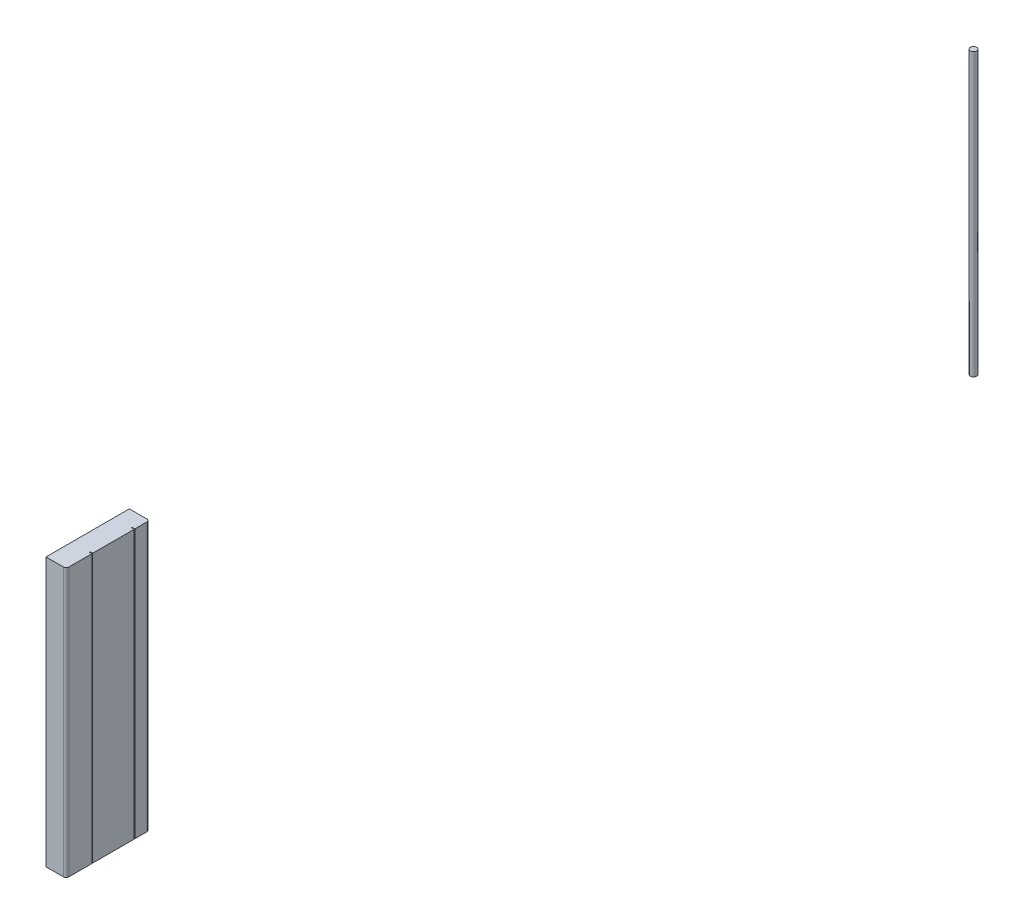
ISO-10303-21;
HEADER;
FILE_DESCRIPTION(('STEP AP214'),'2;1');
FILE_NAME('part.step','',(''),(''),'','','');
FILE_SCHEMA(('AUTOMOTIVE_DESIGN { 1 0 10303 214 1 1 1 1 }'));
ENDSEC;
DATA;
#1=APPLICATION_CONTEXT('core data for automotive mechanical design processes');
#2=APPLICATION_PROTOCOL_DEFINITION('international standard','automotive_design',2000,#1);
#3=PRODUCT_CONTEXT('',#1,'mechanical');
#4=PRODUCT('Part','Part','',(#3));
#5=PRODUCT_RELATED_PRODUCT_CATEGORY('part','',(#4));
#6=PRODUCT_DEFINITION_FORMATION('','',#4);
#7=PRODUCT_DEFINITION_CONTEXT('part definition',#1,'design');
#8=PRODUCT_DEFINITION('design','',#6,#7);
#9=PRODUCT_DEFINITION_SHAPE('','',#8);
#10=(LENGTH_UNIT() NAMED_UNIT(*) SI_UNIT(.MILLI.,.METRE.));
#11=(NAMED_UNIT(*) PLANE_ANGLE_UNIT() SI_UNIT($,.RADIAN.));
#12=(NAMED_UNIT(*) SI_UNIT($,.STERADIAN.) SOLID_ANGLE_UNIT());
#13=UNCERTAINTY_MEASURE_WITH_UNIT(LENGTH_MEASURE(1.E-05),#10,'distance_accuracy_value','');
#14=(GEOMETRIC_REPRESENTATION_CONTEXT(3) GLOBAL_UNCERTAINTY_ASSIGNED_CONTEXT((#13)) GLOBAL_UNIT_ASSIGNED_CONTEXT((#10,
#11,#12)) REPRESENTATION_CONTEXT('',''));
#15=CARTESIAN_POINT('',(0.,0.,0.));
#16=DIRECTION('',(0.,0.,1.));
#17=DIRECTION('',(1.,0.,0.));
#18=AXIS2_PLACEMENT_3D('',#15,#16,#17);
#19=CARTESIAN_POINT('',(25.4999999999946,200.,-606.898242678905));
#20=DIRECTION('',(0.,-1.,0.));
#21=DIRECTION('',(0.,0.,-1.));
#22=AXIS2_PLACEMENT_3D('',#19,#20,#21);
#23=CYLINDRICAL_SURFACE('',#22,2.35997716586148);
#24=CARTESIAN_POINT('',(25.4999999999946,200.,-606.898242678905));
#25=DIRECTION('',(0.,1.,0.));
#26=DIRECTION('',(0.,0.,1.));
#27=AXIS2_PLACEMENT_3D('',#24,#25,#26);
#28=CIRCLE('',#27,2.35997716586148);
#29=CARTESIAN_POINT('',(25.4999999999946,200.,-604.538265513043));
#30=VERTEX_POINT('',#29);
#31=EDGE_CURVE('E11',#30,#30,#28,.T.);
#32=ORIENTED_EDGE('',*,*,#31,.F.);
#33=EDGE_LOOP('',(#32));
#34=FACE_BOUND('',#33,.T.);
#35=CARTESIAN_POINT('',(25.4999999999946,-10.,-606.898242678905));
#36=DIRECTION('',(0.,1.,0.));
#37=DIRECTION('',(0.,0.,1.));
#38=AXIS2_PLACEMENT_3D('',#35,#36,#37);
#39=CIRCLE('',#38,2.35997716586148);
#40=CARTESIAN_POINT('',(25.4999999999946,-10.,-604.538265513043));
#41=VERTEX_POINT('',#40);
#42=EDGE_CURVE('E45',#41,#41,#39,.T.);
#43=ORIENTED_EDGE('',*,*,#42,.T.);
#44=EDGE_LOOP('',(#43));
#45=FACE_BOUND('',#44,.T.);
#46=ADVANCED_FACE('F42',(#34,#45),#23,.T.);
#47=CARTESIAN_POINT('',(25.4999999999946,200.,-606.898242678905));
#48=DIRECTION('',(0.,1.,0.));
#49=DIRECTION('',(0.,0.,1.));
#50=AXIS2_PLACEMENT_3D('',#47,#48,#49);
#51=PLANE('',#50);
#52=ORIENTED_EDGE('',*,*,#31,.T.);
#53=EDGE_LOOP('',(#52));
#54=FACE_BOUND('',#53,.T.);
#55=ADVANCED_FACE('F57',(#54),#51,.T.);
#56=CARTESIAN_POINT('',(25.4999999999946,-10.,-606.898242678905));
#57=DIRECTION('',(0.,1.,0.));
#58=DIRECTION('',(0.,0.,1.));
#59=AXIS2_PLACEMENT_3D('',#56,#57,#58);
#60=PLANE('',#59);
#61=ORIENTED_EDGE('',*,*,#42,.F.);
#62=EDGE_LOOP('',(#61));
#63=FACE_BOUND('',#62,.T.);
#64=ADVANCED_FACE('F55',(#63),#60,.F.);
#65=CLOSED_SHELL('',(#46,#55,#64));
#66=MANIFOLD_SOLID_BREP('B2',#65);
#67=CARTESIAN_POINT('',(15.,0.,0.));
#68=DIRECTION('',(1.,0.,0.));
#69=DIRECTION('',(0.,0.,-1.));
#70=AXIS2_PLACEMENT_3D('',#67,#68,#69);
#71=PLANE('',#70);
#72=DIRECTION('',(0.,1.,0.));
#73=VECTOR('',#72,1.);
#74=CARTESIAN_POINT('',(15.,-7.67878846411751,39.0017573210898));
#75=LINE('',#74,#73);
#76=CARTESIAN_POINT('',(15.,-7.67878846411751,39.0017573210898));
#77=VERTEX_POINT('',#76);
#78=CARTESIAN_POINT('',(15.,192.321211535882,39.0017573210898));
#79=VERTEX_POINT('',#78);
#80=EDGE_CURVE('E217',#77,#79,#75,.T.);
#81=ORIENTED_EDGE('',*,*,#80,.F.);
#82=DIRECTION('',(0.,0.,-1.));
#83=VECTOR('',#82,1.);
#84=CARTESIAN_POINT('',(15.,-7.67878846411751,58.8017573210898));
#85=LINE('',#84,#83);
#86=CARTESIAN_POINT('',(15.,-7.67878846411751,8.10175732108984));
#87=VERTEX_POINT('',#86);
#88=EDGE_CURVE('E249',#77,#87,#85,.T.);
#89=ORIENTED_EDGE('',*,*,#88,.T.);
#90=DIRECTION('',(0.,1.,0.));
#91=VECTOR('',#90,1.);
#92=CARTESIAN_POINT('',(15.,-7.67878846411751,8.10175732108984));
#93=LINE('',#92,#91);
#94=CARTESIAN_POINT('',(15.,192.321211535882,8.10175732108984));
#95=VERTEX_POINT('',#94);
#96=EDGE_CURVE('E242',#87,#95,#93,.T.);
#97=ORIENTED_EDGE('',*,*,#96,.T.);
#98=DIRECTION('',(0.,0.,1.));
#99=VECTOR('',#98,1.);
#100=CARTESIAN_POINT('',(15.,192.321211535882,58.8017573210898));
#101=LINE('',#100,#99);
#102=EDGE_CURVE('E254',#95,#79,#101,.T.);
#103=ORIENTED_EDGE('',*,*,#102,.T.);
#104=EDGE_LOOP('',(#81,#89,#97,#103));
#105=FACE_BOUND('',#104,.T.);
#106=ADVANCED_FACE('F82',(#105),#71,.T.);
#107=CARTESIAN_POINT('',(15.,-7.67878846411751,7.60175732108984));
#108=VERTEX_POINT('',#107);
#109=CARTESIAN_POINT('',(15.,-7.67878846411751,-1.29824267891019));
#110=VERTEX_POINT('',#109);
#111=EDGE_CURVE('E250',#108,#110,#85,.T.);
#112=ORIENTED_EDGE('',*,*,#111,.T.);
#113=DIRECTION('',(0.,1.,0.));
#114=VECTOR('',#113,1.);
#115=CARTESIAN_POINT('',(15.,192.321211535882,-1.29824267891016));
#116=LINE('',#115,#114);
#117=CARTESIAN_POINT('',(15.,192.321211535882,-1.29824267891016));
#118=VERTEX_POINT('',#117);
#119=EDGE_CURVE('E273',#110,#118,#116,.T.);
#120=ORIENTED_EDGE('',*,*,#119,.T.);
#121=CARTESIAN_POINT('',(15.,192.321211535882,7.60175732108984));
#122=VERTEX_POINT('',#121);
#123=EDGE_CURVE('E251',#118,#122,#101,.T.);
#124=ORIENTED_EDGE('',*,*,#123,.T.);
#125=DIRECTION('',(0.,1.,0.));
#126=VECTOR('',#125,1.);
#127=CARTESIAN_POINT('',(15.,-7.67878846411751,7.60175732108984));
#128=LINE('',#127,#126);
#129=EDGE_CURVE('E239',#108,#122,#128,.T.);
#130=ORIENTED_EDGE('',*,*,#129,.F.);
#131=EDGE_LOOP('',(#112,#120,#124,#130));
#132=FACE_BOUND('',#131,.T.);
#133=ADVANCED_FACE('F312',(#132),#71,.T.);
#134=CARTESIAN_POINT('',(15.,192.321211535882,58.8017573210898));
#135=DIRECTION('',(0.,0.,-1.));
#136=DIRECTION('',(0.,1.,0.));
#137=AXIS2_PLACEMENT_3D('',#134,#135,#136);
#138=PLANE('',#137);
#139=DIRECTION('',(-1.,0.,0.));
#140=VECTOR('',#139,1.);
#141=CARTESIAN_POINT('',(15.,-7.67878846411751,58.8017573210898));
#142=LINE('',#141,#140);
#143=CARTESIAN_POINT('',(13.,-7.67878846411751,58.8017573210898));
#144=VERTEX_POINT('',#143);
#145=CARTESIAN_POINT('',(0.,-7.67878846411751,58.8017573210898));
#146=VERTEX_POINT('',#145);
#147=EDGE_CURVE('E271',#144,#146,#142,.T.);
#148=ORIENTED_EDGE('',*,*,#147,.F.);
#149=DIRECTION('',(0.,-1.,0.));
#150=VECTOR('',#149,1.);
#151=CARTESIAN_POINT('',(13.,192.321211535882,58.8017573210898));
#152=LINE('',#151,#150);
#153=CARTESIAN_POINT('',(13.,192.321211535882,58.8017573210898));
#154=VERTEX_POINT('',#153);
#155=EDGE_CURVE('E40',#144,#154,#152,.F.);
#156=ORIENTED_EDGE('',*,*,#155,.T.);
#157=DIRECTION('',(-1.,0.,0.));
#158=VECTOR('',#157,1.);
#159=CARTESIAN_POINT('',(15.,192.321211535882,58.8017573210898));
#160=LINE('',#159,#158);
#161=CARTESIAN_POINT('',(0.,192.321211535882,58.8017573210898));
#162=VERTEX_POINT('',#161);
#163=EDGE_CURVE('E253',#154,#162,#160,.T.);
#164=ORIENTED_EDGE('',*,*,#163,.T.);
#165=DIRECTION('',(0.,-1.,0.));
#166=VECTOR('',#165,1.);
#167=CARTESIAN_POINT('',(0.,192.321211535882,58.8017573210898));
#168=LINE('',#167,#166);
#169=EDGE_CURVE('E216',#162,#146,#168,.T.);
#170=ORIENTED_EDGE('',*,*,#169,.T.);
#171=EDGE_LOOP('',(#148,#156,#164,#170));
#172=FACE_BOUND('',#171,.T.);
#173=ADVANCED_FACE('F296',(#172),#138,.F.);
#174=CARTESIAN_POINT('',(15.,-7.67878846411751,58.8017573210898));
#175=DIRECTION('',(0.,1.,0.));
#176=DIRECTION('',(0.,0.,1.));
#177=AXIS2_PLACEMENT_3D('',#174,#175,#176);
#178=PLANE('',#177);
#179=DIRECTION('',(-1.,0.,0.));
#180=VECTOR('',#179,1.);
#181=CARTESIAN_POINT('',(15.,-7.67878846411751,-3.29824267891019));
#182=LINE('',#181,#180);
#183=CARTESIAN_POINT('',(13.,-7.67878846411751,-3.29824267891019));
#184=VERTEX_POINT('',#183);
#185=CARTESIAN_POINT('',(0.,-7.67878846411751,-3.29824267891019));
#186=VERTEX_POINT('',#185);
#187=EDGE_CURVE('E269',#184,#186,#182,.T.);
#188=ORIENTED_EDGE('',*,*,#187,.F.);
#189=CARTESIAN_POINT('',(13.,-7.67878846411751,-1.29824267891019));
#190=DIRECTION('',(0.,1.,0.));
#191=DIRECTION('',(0.,0.,1.));
#192=AXIS2_PLACEMENT_3D('',#189,#190,#191);
#193=CIRCLE('',#192,2.);
#194=EDGE_CURVE('E283',#184,#110,#193,.F.);
#195=ORIENTED_EDGE('',*,*,#194,.T.);
#196=ORIENTED_EDGE('',*,*,#111,.F.);
#197=DIRECTION('',(-1.,0.,0.));
#198=VECTOR('',#197,1.);
#199=CARTESIAN_POINT('',(13.,-7.67878846411751,7.60175732108984));
#200=LINE('',#199,#198);
#201=CARTESIAN_POINT('',(13.,-7.67878846411751,7.60175732108984));
#202=VERTEX_POINT('',#201);
#203=EDGE_CURVE('E227',#108,#202,#200,.T.);
#204=ORIENTED_EDGE('',*,*,#203,.T.);
#205=DIRECTION('',(0.,0.,1.));
#206=VECTOR('',#205,1.);
#207=CARTESIAN_POINT('',(13.,-7.67878846411751,7.60175732108984));
#208=LINE('',#207,#206);
#209=CARTESIAN_POINT('',(13.,-7.67878846411751,8.10175732108984));
#210=VERTEX_POINT('',#209);
#211=EDGE_CURVE('E220',#202,#210,#208,.T.);
#212=ORIENTED_EDGE('',*,*,#211,.T.);
#213=DIRECTION('',(1.,0.,0.));
#214=VECTOR('',#213,1.);
#215=CARTESIAN_POINT('',(13.,-7.67878846411751,8.10175732108984));
#216=LINE('',#215,#214);
#217=EDGE_CURVE('E223',#210,#87,#216,.T.);
#218=ORIENTED_EDGE('',*,*,#217,.T.);
#219=ORIENTED_EDGE('',*,*,#88,.F.);
#220=DIRECTION('',(-1.,0.,0.));
#221=VECTOR('',#220,1.);
#222=CARTESIAN_POINT('',(13.,-7.67878846411751,39.0017573210898));
#223=LINE('',#222,#221);
#224=CARTESIAN_POINT('',(13.,-7.67878846411751,39.0017573210898));
#225=VERTEX_POINT('',#224);
#226=EDGE_CURVE('E193',#77,#225,#223,.T.);
#227=ORIENTED_EDGE('',*,*,#226,.T.);
#228=DIRECTION('',(0.,0.,1.));
#229=VECTOR('',#228,1.);
#230=CARTESIAN_POINT('',(13.,-7.67878846411751,39.0017573210898));
#231=LINE('',#230,#229);
#232=CARTESIAN_POINT('',(13.,-7.67878846411751,39.5017573210898));
#233=VERTEX_POINT('',#232);
#234=EDGE_CURVE('E186',#225,#233,#231,.T.);
#235=ORIENTED_EDGE('',*,*,#234,.T.);
#236=DIRECTION('',(1.,0.,0.));
#237=VECTOR('',#236,1.);
#238=CARTESIAN_POINT('',(13.,-7.67878846411751,39.5017573210898));
#239=LINE('',#238,#237);
#240=CARTESIAN_POINT('',(15.,-7.67878846411751,39.5017573210898));
#241=VERTEX_POINT('',#240);
#242=EDGE_CURVE('E197',#233,#241,#239,.T.);
#243=ORIENTED_EDGE('',*,*,#242,.T.);
#244=CARTESIAN_POINT('',(15.,-7.67878846411751,56.8017573210898));
#245=VERTEX_POINT('',#244);
#246=EDGE_CURVE('E246',#245,#241,#85,.T.);
#247=ORIENTED_EDGE('',*,*,#246,.F.);
#248=CARTESIAN_POINT('',(13.,-7.67878846411751,56.8017573210898));
#249=DIRECTION('',(0.,1.,0.));
#250=DIRECTION('',(0.,0.,1.));
#251=AXIS2_PLACEMENT_3D('',#248,#249,#250);
#252=CIRCLE('',#251,2.);
#253=EDGE_CURVE('E97',#245,#144,#252,.F.);
#254=ORIENTED_EDGE('',*,*,#253,.T.);
#255=ORIENTED_EDGE('',*,*,#147,.T.);
#256=DIRECTION('',(0.,0.,-1.));
#257=VECTOR('',#256,1.);
#258=CARTESIAN_POINT('',(0.,-7.67878846411751,58.8017573210898));
#259=LINE('',#258,#257);
#260=EDGE_CURVE('E257',#146,#186,#259,.T.);
#261=ORIENTED_EDGE('',*,*,#260,.T.);
#262=EDGE_LOOP('',(#188,#195,#196,#204,#212,#218,#219,#227,#235,#243,#247,#254,#255,#261));
#263=FACE_BOUND('',#262,.T.);
#264=ADVANCED_FACE('F202',(#263),#178,.F.);
#265=CARTESIAN_POINT('',(15.,192.321211535882,-3.29824267891016));
#266=DIRECTION('',(0.,0.,1.));
#267=DIRECTION('',(0.,-1.,0.));
#268=AXIS2_PLACEMENT_3D('',#265,#266,#267);
#269=PLANE('',#268);
#270=DIRECTION('',(-1.,0.,0.));
#271=VECTOR('',#270,1.);
#272=CARTESIAN_POINT('',(15.,192.321211535882,-3.29824267891016));
#273=LINE('',#272,#271);
#274=CARTESIAN_POINT('',(13.,192.321211535882,-3.29824267891016));
#275=VERTEX_POINT('',#274);
#276=CARTESIAN_POINT('',(0.,192.321211535882,-3.29824267891016));
#277=VERTEX_POINT('',#276);
#278=EDGE_CURVE('E267',#275,#277,#273,.T.);
#279=ORIENTED_EDGE('',*,*,#278,.F.);
#280=DIRECTION('',(0.,1.,0.));
#281=VECTOR('',#280,1.);
#282=CARTESIAN_POINT('',(13.,-7.67878846411751,-3.29824267891019));
#283=LINE('',#282,#281);
#284=EDGE_CURVE('E280',#275,#184,#283,.F.);
#285=ORIENTED_EDGE('',*,*,#284,.T.);
#286=ORIENTED_EDGE('',*,*,#187,.T.);
#287=DIRECTION('',(0.,1.,0.));
#288=VECTOR('',#287,1.);
#289=CARTESIAN_POINT('',(0.,192.321211535882,-3.29824267891016));
#290=LINE('',#289,#288);
#291=EDGE_CURVE('E260',#186,#277,#290,.T.);
#292=ORIENTED_EDGE('',*,*,#291,.T.);
#293=EDGE_LOOP('',(#279,#285,#286,#292));
#294=FACE_BOUND('',#293,.T.);
#295=ADVANCED_FACE('F303',(#294),#269,.F.);
#296=CARTESIAN_POINT('',(15.,192.321211535882,58.8017573210898));
#297=DIRECTION('',(0.,-1.,0.));
#298=DIRECTION('',(0.,0.,-1.));
#299=AXIS2_PLACEMENT_3D('',#296,#297,#298);
#300=PLANE('',#299);
#301=ORIENTED_EDGE('',*,*,#123,.F.);
#302=CARTESIAN_POINT('',(13.,192.321211535882,-1.29824267891016));
#303=DIRECTION('',(0.,-1.,0.));
#304=DIRECTION('',(0.,0.,-1.));
#305=AXIS2_PLACEMENT_3D('',#302,#303,#304);
#306=CIRCLE('',#305,2.);
#307=EDGE_CURVE('E278',#118,#275,#306,.F.);
#308=ORIENTED_EDGE('',*,*,#307,.T.);
#309=ORIENTED_EDGE('',*,*,#278,.T.);
#310=DIRECTION('',(0.,0.,1.));
#311=VECTOR('',#310,1.);
#312=CARTESIAN_POINT('',(0.,192.321211535882,58.8017573210898));
#313=LINE('',#312,#311);
#314=EDGE_CURVE('E263',#277,#162,#313,.T.);
#315=ORIENTED_EDGE('',*,*,#314,.T.);
#316=ORIENTED_EDGE('',*,*,#163,.F.);
#317=CARTESIAN_POINT('',(13.,192.321211535882,56.8017573210898));
#318=DIRECTION('',(0.,-1.,0.));
#319=DIRECTION('',(0.,0.,-1.));
#320=AXIS2_PLACEMENT_3D('',#317,#318,#319);
#321=CIRCLE('',#320,2.);
#322=CARTESIAN_POINT('',(15.,192.321211535882,56.8017573210898));
#323=VERTEX_POINT('',#322);
#324=EDGE_CURVE('E276',#154,#323,#321,.F.);
#325=ORIENTED_EDGE('',*,*,#324,.T.);
#326=CARTESIAN_POINT('',(15.,192.321211535882,39.5017573210898));
#327=VERTEX_POINT('',#326);
#328=EDGE_CURVE('E248',#327,#323,#101,.T.);
#329=ORIENTED_EDGE('',*,*,#328,.F.);
#330=DIRECTION('',(1.,0.,0.));
#331=VECTOR('',#330,1.);
#332=CARTESIAN_POINT('',(13.,192.321211535882,39.5017573210898));
#333=LINE('',#332,#331);
#334=CARTESIAN_POINT('',(13.,192.321211535882,39.5017573210898));
#335=VERTEX_POINT('',#334);
#336=EDGE_CURVE('E207',#335,#327,#333,.T.);
#337=ORIENTED_EDGE('',*,*,#336,.F.);
#338=DIRECTION('',(0.,0.,1.));
#339=VECTOR('',#338,1.);
#340=CARTESIAN_POINT('',(13.,192.321211535882,39.0017573210898));
#341=LINE('',#340,#339);
#342=CARTESIAN_POINT('',(13.,192.321211535882,39.0017573210898));
#343=VERTEX_POINT('',#342);
#344=EDGE_CURVE('E189',#343,#335,#341,.T.);
#345=ORIENTED_EDGE('',*,*,#344,.F.);
#346=DIRECTION('',(-1.,0.,0.));
#347=VECTOR('',#346,1.);
#348=CARTESIAN_POINT('',(13.,192.321211535882,39.0017573210898));
#349=LINE('',#348,#347);
#350=EDGE_CURVE('E204',#79,#343,#349,.T.);
#351=ORIENTED_EDGE('',*,*,#350,.F.);
#352=ORIENTED_EDGE('',*,*,#102,.F.);
#353=DIRECTION('',(1.,0.,0.));
#354=VECTOR('',#353,1.);
#355=CARTESIAN_POINT('',(13.,192.321211535882,8.10175732108984));
#356=LINE('',#355,#354);
#357=CARTESIAN_POINT('',(13.,192.321211535882,8.10175732108984));
#358=VERTEX_POINT('',#357);
#359=EDGE_CURVE('E234',#358,#95,#356,.T.);
#360=ORIENTED_EDGE('',*,*,#359,.F.);
#361=DIRECTION('',(0.,0.,1.));
#362=VECTOR('',#361,1.);
#363=CARTESIAN_POINT('',(13.,192.321211535882,7.60175732108984));
#364=LINE('',#363,#362);
#365=CARTESIAN_POINT('',(13.,192.321211535882,7.60175732108984));
#366=VERTEX_POINT('',#365);
#367=EDGE_CURVE('E231',#366,#358,#364,.T.);
#368=ORIENTED_EDGE('',*,*,#367,.F.);
#369=DIRECTION('',(-1.,0.,0.));
#370=VECTOR('',#369,1.);
#371=CARTESIAN_POINT('',(13.,192.321211535882,7.60175732108984));
#372=LINE('',#371,#370);
#373=EDGE_CURVE('E224',#122,#366,#372,.T.);
#374=ORIENTED_EDGE('',*,*,#373,.F.);
#375=EDGE_LOOP('',(#301,#308,#309,#315,#316,#325,#329,#337,#345,#351,#352,#360,#368,#374));
#376=FACE_BOUND('',#375,.T.);
#377=ADVANCED_FACE('F292',(#376),#300,.F.);
#378=ORIENTED_EDGE('',*,*,#328,.T.);
#379=DIRECTION('',(0.,-1.,0.));
#380=VECTOR('',#379,1.);
#381=CARTESIAN_POINT('',(15.,-7.67878846411751,56.8017573210898));
#382=LINE('',#381,#380);
#383=EDGE_CURVE('E90',#323,#245,#382,.T.);
#384=ORIENTED_EDGE('',*,*,#383,.T.);
#385=ORIENTED_EDGE('',*,*,#246,.T.);
#386=DIRECTION('',(0.,1.,0.));
#387=VECTOR('',#386,1.);
#388=CARTESIAN_POINT('',(15.,-7.67878846411751,39.5017573210898));
#389=LINE('',#388,#387);
#390=EDGE_CURVE('E192',#241,#327,#389,.T.);
#391=ORIENTED_EDGE('',*,*,#390,.T.);
#392=EDGE_LOOP('',(#378,#384,#385,#391));
#393=FACE_BOUND('',#392,.T.);
#394=ADVANCED_FACE('F286',(#393),#71,.T.);
#395=CARTESIAN_POINT('',(0.,0.,0.));
#396=DIRECTION('',(1.,0.,0.));
#397=DIRECTION('',(0.,0.,-1.));
#398=AXIS2_PLACEMENT_3D('',#395,#396,#397);
#399=PLANE('',#398);
#400=ORIENTED_EDGE('',*,*,#169,.F.);
#401=ORIENTED_EDGE('',*,*,#314,.F.);
#402=ORIENTED_EDGE('',*,*,#291,.F.);
#403=ORIENTED_EDGE('',*,*,#260,.F.);
#404=EDGE_LOOP('',(#400,#401,#402,#403));
#405=FACE_BOUND('',#404,.T.);
#406=ADVANCED_FACE('F300',(#405),#399,.F.);
#407=CARTESIAN_POINT('',(13.,-7.67878846411751,7.60175732108984));
#408=DIRECTION('',(-1.,0.,0.));
#409=DIRECTION('',(0.,0.,1.));
#410=AXIS2_PLACEMENT_3D('',#407,#408,#409);
#411=PLANE('',#410);
#412=ORIENTED_EDGE('',*,*,#367,.T.);
#413=DIRECTION('',(0.,1.,0.));
#414=VECTOR('',#413,1.);
#415=CARTESIAN_POINT('',(13.,-7.67878846411751,8.10175732108984));
#416=LINE('',#415,#414);
#417=EDGE_CURVE('E230',#210,#358,#416,.T.);
#418=ORIENTED_EDGE('',*,*,#417,.F.);
#419=ORIENTED_EDGE('',*,*,#211,.F.);
#420=DIRECTION('',(0.,1.,0.));
#421=VECTOR('',#420,1.);
#422=CARTESIAN_POINT('',(13.,-7.67878846411751,7.60175732108984));
#423=LINE('',#422,#421);
#424=EDGE_CURVE('E212',#202,#366,#423,.T.);
#425=ORIENTED_EDGE('',*,*,#424,.T.);
#426=EDGE_LOOP('',(#412,#418,#419,#425));
#427=FACE_BOUND('',#426,.T.);
#428=ADVANCED_FACE('F351',(#427),#411,.F.);
#429=CARTESIAN_POINT('',(13.,-7.67878846411751,7.60175732108984));
#430=DIRECTION('',(0.,0.,-1.));
#431=DIRECTION('',(-1.,0.,0.));
#432=AXIS2_PLACEMENT_3D('',#429,#430,#431);
#433=PLANE('',#432);
#434=ORIENTED_EDGE('',*,*,#373,.T.);
#435=ORIENTED_EDGE('',*,*,#424,.F.);
#436=ORIENTED_EDGE('',*,*,#203,.F.);
#437=ORIENTED_EDGE('',*,*,#129,.T.);
#438=EDGE_LOOP('',(#434,#435,#436,#437));
#439=FACE_BOUND('',#438,.T.);
#440=ADVANCED_FACE('F318',(#439),#433,.F.);
#441=CARTESIAN_POINT('',(13.,-7.67878846411751,8.10175732108984));
#442=DIRECTION('',(0.,0.,1.));
#443=DIRECTION('',(1.,0.,0.));
#444=AXIS2_PLACEMENT_3D('',#441,#442,#443);
#445=PLANE('',#444);
#446=ORIENTED_EDGE('',*,*,#359,.T.);
#447=ORIENTED_EDGE('',*,*,#96,.F.);
#448=ORIENTED_EDGE('',*,*,#217,.F.);
#449=ORIENTED_EDGE('',*,*,#417,.T.);
#450=EDGE_LOOP('',(#446,#447,#448,#449));
#451=FACE_BOUND('',#450,.T.);
#452=ADVANCED_FACE('F327',(#451),#445,.F.);
#453=CARTESIAN_POINT('',(13.,-7.67878846411751,39.0017573210898));
#454=DIRECTION('',(-1.,0.,0.));
#455=DIRECTION('',(0.,0.,1.));
#456=AXIS2_PLACEMENT_3D('',#453,#454,#455);
#457=PLANE('',#456);
#458=ORIENTED_EDGE('',*,*,#344,.T.);
#459=DIRECTION('',(0.,1.,0.));
#460=VECTOR('',#459,1.);
#461=CARTESIAN_POINT('',(13.,-7.67878846411751,39.5017573210898));
#462=LINE('',#461,#460);
#463=EDGE_CURVE('E182',#233,#335,#462,.T.);
#464=ORIENTED_EDGE('',*,*,#463,.F.);
#465=ORIENTED_EDGE('',*,*,#234,.F.);
#466=DIRECTION('',(0.,1.,0.));
#467=VECTOR('',#466,1.);
#468=CARTESIAN_POINT('',(13.,-7.67878846411751,39.0017573210898));
#469=LINE('',#468,#467);
#470=EDGE_CURVE('E214',#225,#343,#469,.T.);
#471=ORIENTED_EDGE('',*,*,#470,.T.);
#472=EDGE_LOOP('',(#458,#464,#465,#471));
#473=FACE_BOUND('',#472,.T.);
#474=ADVANCED_FACE('F184',(#473),#457,.F.);
#475=CARTESIAN_POINT('',(13.,-7.67878846411751,39.0017573210898));
#476=DIRECTION('',(0.,0.,-1.));
#477=DIRECTION('',(-1.,0.,0.));
#478=AXIS2_PLACEMENT_3D('',#475,#476,#477);
#479=PLANE('',#478);
#480=ORIENTED_EDGE('',*,*,#350,.T.);
#481=ORIENTED_EDGE('',*,*,#470,.F.);
#482=ORIENTED_EDGE('',*,*,#226,.F.);
#483=ORIENTED_EDGE('',*,*,#80,.T.);
#484=EDGE_LOOP('',(#480,#481,#482,#483));
#485=FACE_BOUND('',#484,.T.);
#486=ADVANCED_FACE('F330',(#485),#479,.F.);
#487=CARTESIAN_POINT('',(13.,-7.67878846411751,39.5017573210898));
#488=DIRECTION('',(0.,0.,1.));
#489=DIRECTION('',(1.,0.,0.));
#490=AXIS2_PLACEMENT_3D('',#487,#488,#489);
#491=PLANE('',#490);
#492=ORIENTED_EDGE('',*,*,#336,.T.);
#493=ORIENTED_EDGE('',*,*,#390,.F.);
#494=ORIENTED_EDGE('',*,*,#242,.F.);
#495=ORIENTED_EDGE('',*,*,#463,.T.);
#496=EDGE_LOOP('',(#492,#493,#494,#495));
#497=FACE_BOUND('',#496,.T.);
#498=ADVANCED_FACE('F198',(#497),#491,.F.);
#499=CARTESIAN_POINT('',(13.,0.,-1.29824267891019));
#500=DIRECTION('',(0.,-1.,0.));
#501=DIRECTION('',(0.,0.,-1.));
#502=AXIS2_PLACEMENT_3D('',#499,#500,#501);
#503=CYLINDRICAL_SURFACE('',#502,2.);
#504=ORIENTED_EDGE('',*,*,#194,.F.);
#505=ORIENTED_EDGE('',*,*,#284,.F.);
#506=ORIENTED_EDGE('',*,*,#307,.F.);
#507=ORIENTED_EDGE('',*,*,#119,.F.);
#508=EDGE_LOOP('',(#504,#505,#506,#507));
#509=FACE_BOUND('',#508,.T.);
#510=ADVANCED_FACE('F310',(#509),#503,.T.);
#511=CARTESIAN_POINT('',(13.,0.,56.8017573210898));
#512=DIRECTION('',(0.,1.,0.));
#513=DIRECTION('',(0.,0.,1.));
#514=AXIS2_PLACEMENT_3D('',#511,#512,#513);
#515=CYLINDRICAL_SURFACE('',#514,2.);
#516=ORIENTED_EDGE('',*,*,#324,.F.);
#517=ORIENTED_EDGE('',*,*,#155,.F.);
#518=ORIENTED_EDGE('',*,*,#253,.F.);
#519=ORIENTED_EDGE('',*,*,#383,.F.);
#520=EDGE_LOOP('',(#516,#517,#518,#519));
#521=FACE_BOUND('',#520,.T.);
#522=ADVANCED_FACE('F84',(#521),#515,.T.);
#523=CLOSED_SHELL('',(#106,#133,#173,#264,#295,#377,#394,#406,#428,#440,#452,#474,#486,#498,
#510,#522));
#524=MANIFOLD_SOLID_BREP('B6',#523);
#525=ADVANCED_BREP_SHAPE_REPRESENTATION('',(#18,#66,#524),#14);
#526=SHAPE_DEFINITION_REPRESENTATION(#9,#525);
ENDSEC;
END-ISO-10303-21;
